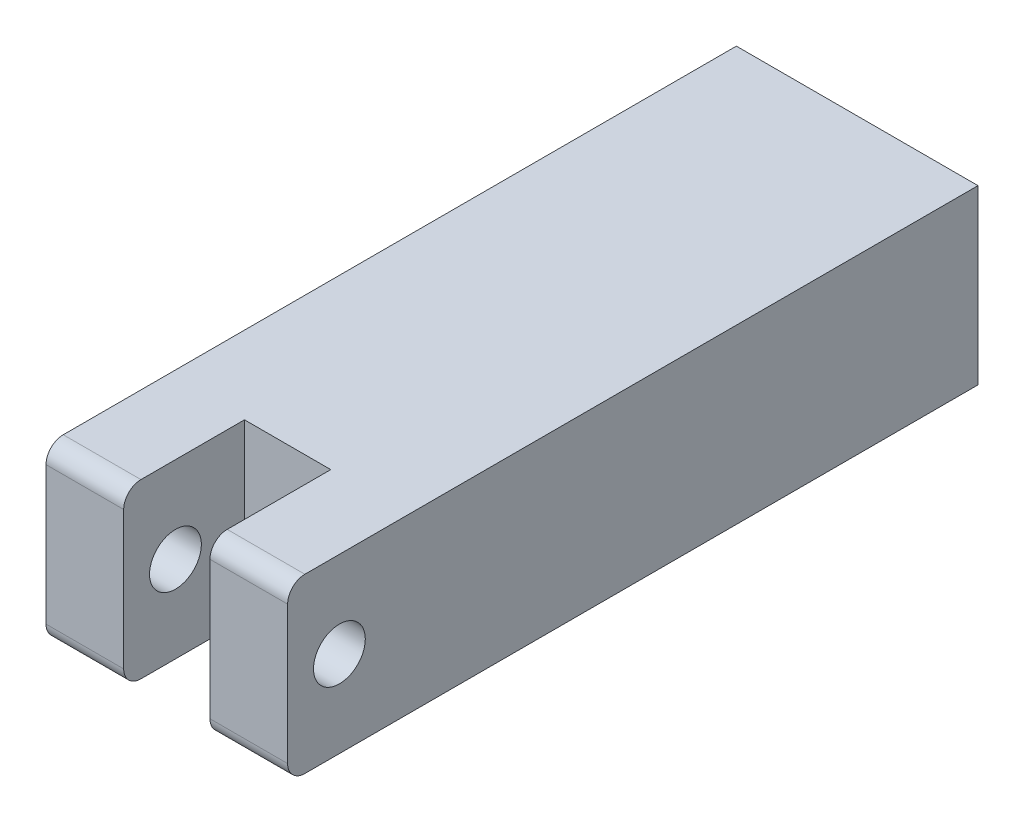
ISO-10303-21;
HEADER;
FILE_DESCRIPTION(('STEP AP214'),'2;1');
FILE_NAME('part.step','',(''),(''),'','','');
FILE_SCHEMA(('AUTOMOTIVE_DESIGN { 1 0 10303 214 1 1 1 1 }'));
ENDSEC;
DATA;
#1=APPLICATION_CONTEXT('core data for automotive mechanical design processes');
#2=APPLICATION_PROTOCOL_DEFINITION('international standard','automotive_design',2000,#1);
#3=PRODUCT_CONTEXT('',#1,'mechanical');
#4=PRODUCT('Part','Part','',(#3));
#5=PRODUCT_RELATED_PRODUCT_CATEGORY('part','',(#4));
#6=PRODUCT_DEFINITION_FORMATION('','',#4);
#7=PRODUCT_DEFINITION_CONTEXT('part definition',#1,'design');
#8=PRODUCT_DEFINITION('design','',#6,#7);
#9=PRODUCT_DEFINITION_SHAPE('','',#8);
#10=(LENGTH_UNIT() NAMED_UNIT(*) SI_UNIT(.MILLI.,.METRE.));
#11=(NAMED_UNIT(*) PLANE_ANGLE_UNIT() SI_UNIT($,.RADIAN.));
#12=(NAMED_UNIT(*) SI_UNIT($,.STERADIAN.) SOLID_ANGLE_UNIT());
#13=UNCERTAINTY_MEASURE_WITH_UNIT(LENGTH_MEASURE(1.E-05),#10,'distance_accuracy_value','');
#14=(GEOMETRIC_REPRESENTATION_CONTEXT(3) GLOBAL_UNCERTAINTY_ASSIGNED_CONTEXT((#13)) GLOBAL_UNIT_ASSIGNED_CONTEXT((#10,
#11,#12)) REPRESENTATION_CONTEXT('',''));
#15=CARTESIAN_POINT('',(0.,0.,0.));
#16=DIRECTION('',(0.,0.,1.));
#17=DIRECTION('',(1.,0.,0.));
#18=AXIS2_PLACEMENT_3D('',#15,#16,#17);
#19=CARTESIAN_POINT('',(0.,0.,13.));
#20=DIRECTION('',(0.,0.,-1.));
#21=DIRECTION('',(-1.,0.,0.));
#22=AXIS2_PLACEMENT_3D('',#19,#20,#21);
#23=CYLINDRICAL_SURFACE('',#22,1.5);
#24=CARTESIAN_POINT('',(0.,0.,-15.));
#25=DIRECTION('',(0.,0.,1.));
#26=DIRECTION('',(1.,0.,0.));
#27=AXIS2_PLACEMENT_3D('',#24,#25,#26);
#28=CIRCLE('',#27,1.5);
#29=CARTESIAN_POINT('',(-1.5,0.,-15.));
#30=VERTEX_POINT('',#29);
#31=EDGE_CURVE('E242',#30,#30,#28,.T.);
#32=CARTESIAN_POINT('',(0.,0.,-1.5));
#33=DIRECTION('',(0.,0.,1.));
#34=DIRECTION('',(1.,0.,0.));
#35=AXIS2_PLACEMENT_3D('',#32,#33,#34);
#36=CIRCLE('',#35,1.5);
#37=CARTESIAN_POINT('',(-1.5,0.,-1.5));
#38=VERTEX_POINT('',#37);
#39=EDGE_CURVE('E37',#38,#38,#36,.T.);
#40=CARTESIAN_POINT('',(-1.5,0.,-15.));
#41=CARTESIAN_POINT('',(-1.5,0.,-14.859375));
#42=CARTESIAN_POINT('',(-1.5,0.,-14.71875));
#43=CARTESIAN_POINT('',(-1.5,0.,-14.4375));
#44=CARTESIAN_POINT('',(-1.5,0.,-14.296875));
#45=CARTESIAN_POINT('',(-1.5,0.,-14.015625));
#46=CARTESIAN_POINT('',(-1.5,0.,-13.875));
#47=CARTESIAN_POINT('',(-1.5,0.,-13.59375));
#48=CARTESIAN_POINT('',(-1.5,0.,-13.453125));
#49=CARTESIAN_POINT('',(-1.5,0.,-13.171875));
#50=CARTESIAN_POINT('',(-1.5,0.,-13.03125));
#51=CARTESIAN_POINT('',(-1.5,0.,-12.75));
#52=CARTESIAN_POINT('',(-1.5,0.,-12.609375));
#53=CARTESIAN_POINT('',(-1.5,0.,-12.328125));
#54=CARTESIAN_POINT('',(-1.5,0.,-12.1875));
#55=CARTESIAN_POINT('',(-1.5,0.,-11.90625));
#56=CARTESIAN_POINT('',(-1.5,0.,-11.765625));
#57=CARTESIAN_POINT('',(-1.5,0.,-11.484375));
#58=CARTESIAN_POINT('',(-1.5,0.,-11.34375));
#59=CARTESIAN_POINT('',(-1.5,0.,-11.0625));
#60=CARTESIAN_POINT('',(-1.5,0.,-10.921875));
#61=CARTESIAN_POINT('',(-1.5,0.,-10.640625));
#62=CARTESIAN_POINT('',(-1.5,0.,-10.5));
#63=CARTESIAN_POINT('',(-1.5,0.,-10.21875));
#64=CARTESIAN_POINT('',(-1.5,0.,-10.078125));
#65=CARTESIAN_POINT('',(-1.5,0.,-9.796875));
#66=CARTESIAN_POINT('',(-1.5,0.,-9.65625));
#67=CARTESIAN_POINT('',(-1.5,0.,-9.375));
#68=CARTESIAN_POINT('',(-1.5,0.,-9.234375));
#69=CARTESIAN_POINT('',(-1.5,0.,-8.953125));
#70=CARTESIAN_POINT('',(-1.5,0.,-8.8125));
#71=CARTESIAN_POINT('',(-1.5,0.,-8.53125));
#72=CARTESIAN_POINT('',(-1.5,0.,-8.390625));
#73=CARTESIAN_POINT('',(-1.5,0.,-8.109375));
#74=CARTESIAN_POINT('',(-1.5,0.,-7.96875));
#75=CARTESIAN_POINT('',(-1.5,0.,-7.6875));
#76=CARTESIAN_POINT('',(-1.5,0.,-7.546875));
#77=CARTESIAN_POINT('',(-1.5,0.,-7.265625));
#78=CARTESIAN_POINT('',(-1.5,0.,-7.125));
#79=CARTESIAN_POINT('',(-1.5,0.,-6.84375));
#80=CARTESIAN_POINT('',(-1.5,0.,-6.703125));
#81=CARTESIAN_POINT('',(-1.5,0.,-6.421875));
#82=CARTESIAN_POINT('',(-1.5,0.,-6.28125));
#83=CARTESIAN_POINT('',(-1.5,0.,-6.));
#84=CARTESIAN_POINT('',(-1.5,0.,-5.859375));
#85=CARTESIAN_POINT('',(-1.5,0.,-5.578125));
#86=CARTESIAN_POINT('',(-1.5,0.,-5.4375));
#87=CARTESIAN_POINT('',(-1.5,0.,-5.15625));
#88=CARTESIAN_POINT('',(-1.5,0.,-5.015625));
#89=CARTESIAN_POINT('',(-1.5,0.,-4.734375));
#90=CARTESIAN_POINT('',(-1.5,0.,-4.59375));
#91=CARTESIAN_POINT('',(-1.5,0.,-4.3125));
#92=CARTESIAN_POINT('',(-1.5,0.,-4.171875));
#93=CARTESIAN_POINT('',(-1.5,0.,-3.890625));
#94=CARTESIAN_POINT('',(-1.5,0.,-3.75));
#95=CARTESIAN_POINT('',(-1.5,0.,-3.46875));
#96=CARTESIAN_POINT('',(-1.5,0.,-3.328125));
#97=CARTESIAN_POINT('',(-1.5,0.,-3.046875));
#98=CARTESIAN_POINT('',(-1.5,0.,-2.90625));
#99=CARTESIAN_POINT('',(-1.5,0.,-2.625));
#100=CARTESIAN_POINT('',(-1.5,0.,-2.484375));
#101=CARTESIAN_POINT('',(-1.5,0.,-2.203125));
#102=CARTESIAN_POINT('',(-1.5,0.,-2.0625));
#103=CARTESIAN_POINT('',(-1.5,0.,-1.78125));
#104=CARTESIAN_POINT('',(-1.5,0.,-1.640625));
#105=CARTESIAN_POINT('',(-1.5,0.,-1.5));
#106=B_SPLINE_CURVE_WITH_KNOTS('',3,(#40,#41,#42,#43,#44,#45,#46,#47,#48,#49,#50,#51,#52,#53,
#54,#55,#56,#57,#58,#59,#60,#61,#62,#63,#64,#65,#66,#67,#68,#69,#70,#71,#72,#73,#74,#75,#76,#77,
#78,#79,#80,#81,#82,#83,#84,#85,#86,#87,#88,#89,#90,#91,#92,#93,#94,#95,#96,#97,#98,#99,#100,
#101,#102,#103,#104,#105),.UNSPECIFIED.,.F.,.F.,(4,2,2,2,2,2,2,2,2,2,2,2,2,2,2,2,2,2,2,2,2,2,2,
2,2,2,2,2,2,2,2,2,4),(0.,0.421874999999999,0.843750000000001,1.265625,1.6875,2.109375,2.53125,
2.953125,3.375,3.796875,4.21875,4.640625,5.0625,5.484375,5.90625,6.328125,6.75,7.171875,7.59375,
8.015625,8.4375,8.859375,9.28125,9.703125,10.125,10.546875,10.96875,11.390625,11.8125,12.234375,
12.65625,13.078125,13.5),.UNSPECIFIED.);
#107=EDGE_CURVE('BSEAM33',#30,#38,#106,.T.);
#108=ORIENTED_EDGE('',*,*,#31,.F.);
#109=ORIENTED_EDGE('',*,*,#39,.T.);
#110=ORIENTED_EDGE('',*,*,#107,.T.);
#111=ORIENTED_EDGE('',*,*,#107,.F.);
#112=EDGE_LOOP('',(#108,#110,#109,#111));
#113=FACE_BOUND('',#112,.T.);
#114=ADVANCED_FACE('F33',(#113),#23,.F.);
#115=CARTESIAN_POINT('',(7.,4.,24.));
#116=DIRECTION('',(-1.,0.,0.));
#117=DIRECTION('',(0.,0.,1.));
#118=AXIS2_PLACEMENT_3D('',#115,#116,#117);
#119=CYLINDRICAL_SURFACE('',#118,1.);
#120=DIRECTION('',(-1.,0.,0.));
#121=VECTOR('',#120,1.);
#122=CARTESIAN_POINT('',(7.,4.,25.));
#123=LINE('',#122,#121);
#124=CARTESIAN_POINT('',(-2.5,4.,25.));
#125=VERTEX_POINT('',#124);
#126=CARTESIAN_POINT('',(-7.,4.,25.));
#127=VERTEX_POINT('',#126);
#128=EDGE_CURVE('E295',#125,#127,#123,.T.);
#129=ORIENTED_EDGE('',*,*,#128,.F.);
#130=CARTESIAN_POINT('',(-2.5,4.,24.));
#131=DIRECTION('',(-1.,0.,0.));
#132=DIRECTION('',(0.,0.,1.));
#133=AXIS2_PLACEMENT_3D('',#130,#131,#132);
#134=CIRCLE('',#133,1.);
#135=CARTESIAN_POINT('',(-2.5,5.,24.));
#136=VERTEX_POINT('',#135);
#137=EDGE_CURVE('E239',#125,#136,#134,.T.);
#138=ORIENTED_EDGE('',*,*,#137,.T.);
#139=DIRECTION('',(-1.,0.,0.));
#140=VECTOR('',#139,1.);
#141=CARTESIAN_POINT('',(7.,5.,24.));
#142=LINE('',#141,#140);
#143=CARTESIAN_POINT('',(-7.,5.,24.));
#144=VERTEX_POINT('',#143);
#145=EDGE_CURVE('E299',#136,#144,#142,.T.);
#146=ORIENTED_EDGE('',*,*,#145,.T.);
#147=CARTESIAN_POINT('',(-7.,4.,24.));
#148=DIRECTION('',(1.,0.,0.));
#149=DIRECTION('',(0.,0.,-1.));
#150=AXIS2_PLACEMENT_3D('',#147,#148,#149);
#151=CIRCLE('',#150,1.);
#152=EDGE_CURVE('E275',#144,#127,#151,.T.);
#153=ORIENTED_EDGE('',*,*,#152,.T.);
#154=EDGE_LOOP('',(#129,#138,#146,#153));
#155=FACE_BOUND('',#154,.T.);
#156=ADVANCED_FACE('F325',(#155),#119,.T.);
#157=CARTESIAN_POINT('',(7.,4.,25.));
#158=DIRECTION('',(0.,0.,-1.));
#159=DIRECTION('',(-1.,0.,0.));
#160=AXIS2_PLACEMENT_3D('',#157,#158,#159);
#161=PLANE('',#160);
#162=DIRECTION('',(-1.,0.,0.));
#163=VECTOR('',#162,1.);
#164=CARTESIAN_POINT('',(7.,-4.,25.));
#165=LINE('',#164,#163);
#166=CARTESIAN_POINT('',(-2.5,-4.,25.));
#167=VERTEX_POINT('',#166);
#168=CARTESIAN_POINT('',(-7.,-4.,25.));
#169=VERTEX_POINT('',#168);
#170=EDGE_CURVE('E291',#167,#169,#165,.T.);
#171=ORIENTED_EDGE('',*,*,#170,.F.);
#172=DIRECTION('',(0.,1.,0.));
#173=VECTOR('',#172,1.);
#174=CARTESIAN_POINT('',(-2.5,-5.,25.));
#175=LINE('',#174,#173);
#176=EDGE_CURVE('E219',#167,#125,#175,.T.);
#177=ORIENTED_EDGE('',*,*,#176,.T.);
#178=ORIENTED_EDGE('',*,*,#128,.T.);
#179=DIRECTION('',(0.,-1.,0.));
#180=VECTOR('',#179,1.);
#181=CARTESIAN_POINT('',(-7.,4.,25.));
#182=LINE('',#181,#180);
#183=EDGE_CURVE('E278',#127,#169,#182,.T.);
#184=ORIENTED_EDGE('',*,*,#183,.T.);
#185=EDGE_LOOP('',(#171,#177,#178,#184));
#186=FACE_BOUND('',#185,.T.);
#187=ADVANCED_FACE('F332',(#186),#161,.F.);
#188=CARTESIAN_POINT('',(7.,-4.,24.));
#189=DIRECTION('',(-1.,0.,0.));
#190=DIRECTION('',(0.,0.,1.));
#191=AXIS2_PLACEMENT_3D('',#188,#189,#190);
#192=CYLINDRICAL_SURFACE('',#191,1.);
#193=DIRECTION('',(-1.,0.,0.));
#194=VECTOR('',#193,1.);
#195=CARTESIAN_POINT('',(7.,-5.,24.));
#196=LINE('',#195,#194);
#197=CARTESIAN_POINT('',(-2.5,-5.,24.));
#198=VERTEX_POINT('',#197);
#199=CARTESIAN_POINT('',(-7.,-5.,24.));
#200=VERTEX_POINT('',#199);
#201=EDGE_CURVE('E287',#198,#200,#196,.T.);
#202=ORIENTED_EDGE('',*,*,#201,.F.);
#203=CARTESIAN_POINT('',(-2.5,-4.,24.));
#204=DIRECTION('',(-1.,0.,0.));
#205=DIRECTION('',(0.,0.,1.));
#206=AXIS2_PLACEMENT_3D('',#203,#204,#205);
#207=CIRCLE('',#206,1.);
#208=EDGE_CURVE('E236',#198,#167,#207,.T.);
#209=ORIENTED_EDGE('',*,*,#208,.T.);
#210=ORIENTED_EDGE('',*,*,#170,.T.);
#211=CARTESIAN_POINT('',(-7.,-4.,24.));
#212=DIRECTION('',(1.,0.,0.));
#213=DIRECTION('',(0.,0.,-1.));
#214=AXIS2_PLACEMENT_3D('',#211,#212,#213);
#215=CIRCLE('',#214,1.);
#216=EDGE_CURVE('E281',#169,#200,#215,.T.);
#217=ORIENTED_EDGE('',*,*,#216,.T.);
#218=EDGE_LOOP('',(#202,#209,#210,#217));
#219=FACE_BOUND('',#218,.T.);
#220=ADVANCED_FACE('F427',(#219),#192,.T.);
#221=CARTESIAN_POINT('',(7.,0.,22.));
#222=DIRECTION('',(-1.,0.,0.));
#223=DIRECTION('',(0.,0.,1.));
#224=AXIS2_PLACEMENT_3D('',#221,#222,#223);
#225=CYLINDRICAL_SURFACE('',#224,1.5);
#226=CARTESIAN_POINT('',(-2.5,0.,22.));
#227=DIRECTION('',(-1.,0.,0.));
#228=DIRECTION('',(0.,0.,1.));
#229=AXIS2_PLACEMENT_3D('',#226,#227,#228);
#230=CIRCLE('',#229,1.5);
#231=CARTESIAN_POINT('',(-2.5,0.,23.5));
#232=VERTEX_POINT('',#231);
#233=EDGE_CURVE('E235',#232,#232,#230,.T.);
#234=ORIENTED_EDGE('',*,*,#233,.F.);
#235=EDGE_LOOP('',(#234));
#236=FACE_BOUND('',#235,.T.);
#237=CARTESIAN_POINT('',(-7.,0.,22.));
#238=DIRECTION('',(1.,0.,0.));
#239=DIRECTION('',(0.,0.,-1.));
#240=AXIS2_PLACEMENT_3D('',#237,#238,#239);
#241=CIRCLE('',#240,1.5);
#242=CARTESIAN_POINT('',(-7.,0.,20.5));
#243=VERTEX_POINT('',#242);
#244=EDGE_CURVE('E248',#243,#243,#241,.T.);
#245=ORIENTED_EDGE('',*,*,#244,.F.);
#246=EDGE_LOOP('',(#245));
#247=FACE_BOUND('',#246,.T.);
#248=ADVANCED_FACE('F420',(#236,#247),#225,.F.);
#249=CARTESIAN_POINT('',(7.,-4.,24.));
#250=DIRECTION('',(1.,0.,0.));
#251=DIRECTION('',(0.,0.,-1.));
#252=AXIS2_PLACEMENT_3D('',#249,#250,#251);
#253=PLANE('',#252);
#254=DIRECTION('',(0.,1.,0.));
#255=VECTOR('',#254,1.);
#256=CARTESIAN_POINT('',(7.,5.,-15.));
#257=LINE('',#256,#255);
#258=CARTESIAN_POINT('',(7.,-5.,-15.));
#259=VERTEX_POINT('',#258);
#260=CARTESIAN_POINT('',(7.,5.,-15.));
#261=VERTEX_POINT('',#260);
#262=EDGE_CURVE('E255',#259,#261,#257,.T.);
#263=ORIENTED_EDGE('',*,*,#262,.T.);
#264=DIRECTION('',(0.,0.,1.));
#265=VECTOR('',#264,1.);
#266=CARTESIAN_POINT('',(7.,5.,24.));
#267=LINE('',#266,#265);
#268=CARTESIAN_POINT('',(7.,5.,24.));
#269=VERTEX_POINT('',#268);
#270=EDGE_CURVE('E258',#261,#269,#267,.T.);
#271=ORIENTED_EDGE('',*,*,#270,.T.);
#272=CARTESIAN_POINT('',(7.,4.,24.));
#273=DIRECTION('',(1.,0.,0.));
#274=DIRECTION('',(0.,0.,-1.));
#275=AXIS2_PLACEMENT_3D('',#272,#273,#274);
#276=CIRCLE('',#275,1.);
#277=CARTESIAN_POINT('',(7.,4.,25.));
#278=VERTEX_POINT('',#277);
#279=EDGE_CURVE('E261',#269,#278,#276,.T.);
#280=ORIENTED_EDGE('',*,*,#279,.T.);
#281=DIRECTION('',(0.,-1.,0.));
#282=VECTOR('',#281,1.);
#283=CARTESIAN_POINT('',(7.,4.,25.));
#284=LINE('',#283,#282);
#285=CARTESIAN_POINT('',(7.,-4.,25.));
#286=VERTEX_POINT('',#285);
#287=EDGE_CURVE('E263',#278,#286,#284,.T.);
#288=ORIENTED_EDGE('',*,*,#287,.T.);
#289=CARTESIAN_POINT('',(7.,-4.,24.));
#290=DIRECTION('',(1.,0.,0.));
#291=DIRECTION('',(0.,0.,-1.));
#292=AXIS2_PLACEMENT_3D('',#289,#290,#291);
#293=CIRCLE('',#292,1.);
#294=CARTESIAN_POINT('',(7.,-5.,24.));
#295=VERTEX_POINT('',#294);
#296=EDGE_CURVE('E265',#286,#295,#293,.T.);
#297=ORIENTED_EDGE('',*,*,#296,.T.);
#298=DIRECTION('',(0.,0.,-1.));
#299=VECTOR('',#298,1.);
#300=CARTESIAN_POINT('',(7.,-5.,24.));
#301=LINE('',#300,#299);
#302=EDGE_CURVE('E267',#295,#259,#301,.T.);
#303=ORIENTED_EDGE('',*,*,#302,.T.);
#304=EDGE_LOOP('',(#263,#271,#280,#288,#297,#303));
#305=FACE_BOUND('',#304,.T.);
#306=CARTESIAN_POINT('',(7.,0.,22.));
#307=DIRECTION('',(1.,0.,0.));
#308=DIRECTION('',(0.,0.,-1.));
#309=AXIS2_PLACEMENT_3D('',#306,#307,#308);
#310=CIRCLE('',#309,1.5);
#311=CARTESIAN_POINT('',(7.,0.,20.5));
#312=VERTEX_POINT('',#311);
#313=EDGE_CURVE('E249',#312,#312,#310,.T.);
#314=ORIENTED_EDGE('',*,*,#313,.F.);
#315=EDGE_LOOP('',(#314));
#316=FACE_BOUND('',#315,.T.);
#317=ADVANCED_FACE('F426',(#305,#316),#253,.T.);
#318=CARTESIAN_POINT('',(-7.,-4.,24.));
#319=DIRECTION('',(1.,0.,0.));
#320=DIRECTION('',(0.,0.,-1.));
#321=AXIS2_PLACEMENT_3D('',#318,#319,#320);
#322=PLANE('',#321);
#323=DIRECTION('',(0.,0.,1.));
#324=VECTOR('',#323,1.);
#325=CARTESIAN_POINT('',(-7.,3.,1.5));
#326=LINE('',#325,#324);
#327=CARTESIAN_POINT('',(-7.,3.,-1.5));
#328=VERTEX_POINT('',#327);
#329=CARTESIAN_POINT('',(-7.,3.,1.5));
#330=VERTEX_POINT('',#329);
#331=EDGE_CURVE('E179',#328,#330,#326,.T.);
#332=ORIENTED_EDGE('',*,*,#331,.T.);
#333=DIRECTION('',(0.,-1.,0.));
#334=VECTOR('',#333,1.);
#335=CARTESIAN_POINT('',(-7.,3.,1.5));
#336=LINE('',#335,#334);
#337=CARTESIAN_POINT('',(-7.,-3.,1.5));
#338=VERTEX_POINT('',#337);
#339=EDGE_CURVE('E161',#330,#338,#336,.T.);
#340=ORIENTED_EDGE('',*,*,#339,.T.);
#341=DIRECTION('',(0.,0.,-1.));
#342=VECTOR('',#341,1.);
#343=CARTESIAN_POINT('',(-7.,-3.,1.5));
#344=LINE('',#343,#342);
#345=CARTESIAN_POINT('',(-7.,-3.,-1.5));
#346=VERTEX_POINT('',#345);
#347=EDGE_CURVE('E170',#338,#346,#344,.T.);
#348=ORIENTED_EDGE('',*,*,#347,.T.);
#349=DIRECTION('',(0.,1.,0.));
#350=VECTOR('',#349,1.);
#351=CARTESIAN_POINT('',(-7.,3.,-1.5));
#352=LINE('',#351,#350);
#353=EDGE_CURVE('E174',#346,#328,#352,.T.);
#354=ORIENTED_EDGE('',*,*,#353,.T.);
#355=EDGE_LOOP('',(#332,#340,#348,#354));
#356=FACE_BOUND('',#355,.T.);
#357=DIRECTION('',(0.,1.,0.));
#358=VECTOR('',#357,1.);
#359=CARTESIAN_POINT('',(-7.,5.,-15.));
#360=LINE('',#359,#358);
#361=CARTESIAN_POINT('',(-7.,-5.,-15.));
#362=VERTEX_POINT('',#361);
#363=CARTESIAN_POINT('',(-7.,5.,-15.));
#364=VERTEX_POINT('',#363);
#365=EDGE_CURVE('E252',#362,#364,#360,.T.);
#366=ORIENTED_EDGE('',*,*,#365,.F.);
#367=DIRECTION('',(0.,0.,-1.));
#368=VECTOR('',#367,1.);
#369=CARTESIAN_POINT('',(-7.,-5.,24.));
#370=LINE('',#369,#368);
#371=EDGE_CURVE('E259',#200,#362,#370,.T.);
#372=ORIENTED_EDGE('',*,*,#371,.F.);
#373=ORIENTED_EDGE('',*,*,#216,.F.);
#374=ORIENTED_EDGE('',*,*,#183,.F.);
#375=ORIENTED_EDGE('',*,*,#152,.F.);
#376=DIRECTION('',(0.,0.,1.));
#377=VECTOR('',#376,1.);
#378=CARTESIAN_POINT('',(-7.,5.,24.));
#379=LINE('',#378,#377);
#380=EDGE_CURVE('E272',#364,#144,#379,.T.);
#381=ORIENTED_EDGE('',*,*,#380,.F.);
#382=EDGE_LOOP('',(#366,#372,#373,#374,#375,#381));
#383=FACE_BOUND('',#382,.T.);
#384=ORIENTED_EDGE('',*,*,#244,.T.);
#385=EDGE_LOOP('',(#384));
#386=FACE_BOUND('',#385,.T.);
#387=ADVANCED_FACE('F176',(#356,#383,#386),#322,.F.);
#388=CARTESIAN_POINT('',(7.,5.,-15.));
#389=DIRECTION('',(0.,0.,1.));
#390=DIRECTION('',(0.,-1.,0.));
#391=AXIS2_PLACEMENT_3D('',#388,#389,#390);
#392=PLANE('',#391);
#393=ORIENTED_EDGE('',*,*,#31,.T.);
#394=EDGE_LOOP('',(#393));
#395=FACE_BOUND('',#394,.T.);
#396=ORIENTED_EDGE('',*,*,#365,.T.);
#397=DIRECTION('',(-1.,0.,0.));
#398=VECTOR('',#397,1.);
#399=CARTESIAN_POINT('',(7.,5.,-15.));
#400=LINE('',#399,#398);
#401=EDGE_CURVE('E11',#261,#364,#400,.T.);
#402=ORIENTED_EDGE('',*,*,#401,.F.);
#403=ORIENTED_EDGE('',*,*,#262,.F.);
#404=DIRECTION('',(-1.,0.,0.));
#405=VECTOR('',#404,1.);
#406=CARTESIAN_POINT('',(7.,-5.,-15.));
#407=LINE('',#406,#405);
#408=EDGE_CURVE('E269',#259,#362,#407,.T.);
#409=ORIENTED_EDGE('',*,*,#408,.T.);
#410=EDGE_LOOP('',(#396,#402,#403,#409));
#411=FACE_BOUND('',#410,.T.);
#412=ADVANCED_FACE('F35',(#395,#411),#392,.F.);
#413=CARTESIAN_POINT('',(7.,5.,24.));
#414=DIRECTION('',(0.,-1.,0.));
#415=DIRECTION('',(0.,0.,-1.));
#416=AXIS2_PLACEMENT_3D('',#413,#414,#415);
#417=PLANE('',#416);
#418=ORIENTED_EDGE('',*,*,#145,.F.);
#419=DIRECTION('',(0.,0.,1.));
#420=VECTOR('',#419,1.);
#421=CARTESIAN_POINT('',(-2.5,5.,18.));
#422=LINE('',#421,#420);
#423=CARTESIAN_POINT('',(-2.5,5.,18.));
#424=VERTEX_POINT('',#423);
#425=EDGE_CURVE('E205',#424,#136,#422,.T.);
#426=ORIENTED_EDGE('',*,*,#425,.F.);
#427=DIRECTION('',(-1.,0.,0.));
#428=VECTOR('',#427,1.);
#429=CARTESIAN_POINT('',(-2.5,5.,18.));
#430=LINE('',#429,#428);
#431=CARTESIAN_POINT('',(2.5,5.,18.));
#432=VERTEX_POINT('',#431);
#433=EDGE_CURVE('E209',#432,#424,#430,.T.);
#434=ORIENTED_EDGE('',*,*,#433,.F.);
#435=DIRECTION('',(0.,0.,-1.));
#436=VECTOR('',#435,1.);
#437=CARTESIAN_POINT('',(2.5,5.,18.));
#438=LINE('',#437,#436);
#439=CARTESIAN_POINT('',(2.5,5.,24.));
#440=VERTEX_POINT('',#439);
#441=EDGE_CURVE('E207',#440,#432,#438,.T.);
#442=ORIENTED_EDGE('',*,*,#441,.F.);
#443=EDGE_CURVE('E42',#269,#440,#142,.T.);
#444=ORIENTED_EDGE('',*,*,#443,.F.);
#445=ORIENTED_EDGE('',*,*,#270,.F.);
#446=ORIENTED_EDGE('',*,*,#401,.T.);
#447=ORIENTED_EDGE('',*,*,#380,.T.);
#448=EDGE_LOOP('',(#418,#426,#434,#442,#444,#445,#446,#447));
#449=FACE_BOUND('',#448,.T.);
#450=ADVANCED_FACE('F503',(#449),#417,.F.);
#451=ORIENTED_EDGE('',*,*,#443,.T.);
#452=CARTESIAN_POINT('',(2.5,4.,24.));
#453=DIRECTION('',(1.,0.,0.));
#454=DIRECTION('',(0.,0.,-1.));
#455=AXIS2_PLACEMENT_3D('',#452,#453,#454);
#456=CIRCLE('',#455,1.);
#457=CARTESIAN_POINT('',(2.5,4.,25.));
#458=VERTEX_POINT('',#457);
#459=EDGE_CURVE('E232',#440,#458,#456,.T.);
#460=ORIENTED_EDGE('',*,*,#459,.T.);
#461=EDGE_CURVE('E296',#278,#458,#123,.T.);
#462=ORIENTED_EDGE('',*,*,#461,.F.);
#463=ORIENTED_EDGE('',*,*,#279,.F.);
#464=EDGE_LOOP('',(#451,#460,#462,#463));
#465=FACE_BOUND('',#464,.T.);
#466=ADVANCED_FACE('F335',(#465),#119,.T.);
#467=ORIENTED_EDGE('',*,*,#461,.T.);
#468=DIRECTION('',(0.,1.,0.));
#469=VECTOR('',#468,1.);
#470=CARTESIAN_POINT('',(2.5,-5.,25.));
#471=LINE('',#470,#469);
#472=CARTESIAN_POINT('',(2.5,-4.,25.));
#473=VERTEX_POINT('',#472);
#474=EDGE_CURVE('E225',#473,#458,#471,.T.);
#475=ORIENTED_EDGE('',*,*,#474,.F.);
#476=EDGE_CURVE('E292',#286,#473,#165,.T.);
#477=ORIENTED_EDGE('',*,*,#476,.F.);
#478=ORIENTED_EDGE('',*,*,#287,.F.);
#479=EDGE_LOOP('',(#467,#475,#477,#478));
#480=FACE_BOUND('',#479,.T.);
#481=ADVANCED_FACE('F447',(#480),#161,.F.);
#482=ORIENTED_EDGE('',*,*,#476,.T.);
#483=CARTESIAN_POINT('',(2.5,-4.,24.));
#484=DIRECTION('',(1.,0.,0.));
#485=DIRECTION('',(0.,0.,-1.));
#486=AXIS2_PLACEMENT_3D('',#483,#484,#485);
#487=CIRCLE('',#486,1.);
#488=CARTESIAN_POINT('',(2.5,-5.,24.));
#489=VERTEX_POINT('',#488);
#490=EDGE_CURVE('E229',#473,#489,#487,.T.);
#491=ORIENTED_EDGE('',*,*,#490,.T.);
#492=EDGE_CURVE('E288',#295,#489,#196,.T.);
#493=ORIENTED_EDGE('',*,*,#492,.F.);
#494=ORIENTED_EDGE('',*,*,#296,.F.);
#495=EDGE_LOOP('',(#482,#491,#493,#494));
#496=FACE_BOUND('',#495,.T.);
#497=ADVANCED_FACE('F438',(#496),#192,.T.);
#498=CARTESIAN_POINT('',(7.,-5.,24.));
#499=DIRECTION('',(0.,1.,0.));
#500=DIRECTION('',(0.,0.,1.));
#501=AXIS2_PLACEMENT_3D('',#498,#499,#500);
#502=PLANE('',#501);
#503=DIRECTION('',(-1.,0.,0.));
#504=VECTOR('',#503,1.);
#505=CARTESIAN_POINT('',(-2.5,-5.,18.));
#506=LINE('',#505,#504);
#507=CARTESIAN_POINT('',(2.5,-5.,18.));
#508=VERTEX_POINT('',#507);
#509=CARTESIAN_POINT('',(-2.5,-5.,18.));
#510=VERTEX_POINT('',#509);
#511=EDGE_CURVE('E58',#508,#510,#506,.T.);
#512=ORIENTED_EDGE('',*,*,#511,.T.);
#513=DIRECTION('',(0.,0.,1.));
#514=VECTOR('',#513,1.);
#515=CARTESIAN_POINT('',(-2.5,-5.,18.));
#516=LINE('',#515,#514);
#517=EDGE_CURVE('E212',#510,#198,#516,.T.);
#518=ORIENTED_EDGE('',*,*,#517,.T.);
#519=ORIENTED_EDGE('',*,*,#201,.T.);
#520=ORIENTED_EDGE('',*,*,#371,.T.);
#521=ORIENTED_EDGE('',*,*,#408,.F.);
#522=ORIENTED_EDGE('',*,*,#302,.F.);
#523=ORIENTED_EDGE('',*,*,#492,.T.);
#524=DIRECTION('',(0.,0.,-1.));
#525=VECTOR('',#524,1.);
#526=CARTESIAN_POINT('',(2.5,-5.,18.));
#527=LINE('',#526,#525);
#528=EDGE_CURVE('E215',#489,#508,#527,.T.);
#529=ORIENTED_EDGE('',*,*,#528,.T.);
#530=EDGE_LOOP('',(#512,#518,#519,#520,#521,#522,#523,#529));
#531=FACE_BOUND('',#530,.T.);
#532=ADVANCED_FACE('F526',(#531),#502,.F.);
#533=CARTESIAN_POINT('',(2.5,0.,22.));
#534=DIRECTION('',(1.,0.,0.));
#535=DIRECTION('',(0.,0.,-1.));
#536=AXIS2_PLACEMENT_3D('',#533,#534,#535);
#537=CIRCLE('',#536,1.5);
#538=CARTESIAN_POINT('',(2.5,0.,20.5));
#539=VERTEX_POINT('',#538);
#540=EDGE_CURVE('E222',#539,#539,#537,.T.);
#541=ORIENTED_EDGE('',*,*,#540,.F.);
#542=EDGE_LOOP('',(#541));
#543=FACE_BOUND('',#542,.T.);
#544=ORIENTED_EDGE('',*,*,#313,.T.);
#545=EDGE_LOOP('',(#544));
#546=FACE_BOUND('',#545,.T.);
#547=ADVANCED_FACE('F354',(#543,#546),#225,.F.);
#548=CARTESIAN_POINT('',(-2.5,-5.,18.));
#549=DIRECTION('',(-1.,0.,0.));
#550=DIRECTION('',(0.,0.,1.));
#551=AXIS2_PLACEMENT_3D('',#548,#549,#550);
#552=PLANE('',#551);
#553=ORIENTED_EDGE('',*,*,#233,.T.);
#554=EDGE_LOOP('',(#553));
#555=FACE_BOUND('',#554,.T.);
#556=ORIENTED_EDGE('',*,*,#176,.F.);
#557=ORIENTED_EDGE('',*,*,#208,.F.);
#558=ORIENTED_EDGE('',*,*,#517,.F.);
#559=DIRECTION('',(0.,1.,0.));
#560=VECTOR('',#559,1.);
#561=CARTESIAN_POINT('',(-2.5,-5.,18.));
#562=LINE('',#561,#560);
#563=EDGE_CURVE('E220',#510,#424,#562,.T.);
#564=ORIENTED_EDGE('',*,*,#563,.T.);
#565=ORIENTED_EDGE('',*,*,#425,.T.);
#566=ORIENTED_EDGE('',*,*,#137,.F.);
#567=EDGE_LOOP('',(#556,#557,#558,#564,#565,#566));
#568=FACE_BOUND('',#567,.T.);
#569=ADVANCED_FACE('F350',(#555,#568),#552,.F.);
#570=CARTESIAN_POINT('',(2.5,-5.,18.));
#571=DIRECTION('',(1.,0.,0.));
#572=DIRECTION('',(0.,0.,-1.));
#573=AXIS2_PLACEMENT_3D('',#570,#571,#572);
#574=PLANE('',#573);
#575=ORIENTED_EDGE('',*,*,#540,.T.);
#576=EDGE_LOOP('',(#575));
#577=FACE_BOUND('',#576,.T.);
#578=ORIENTED_EDGE('',*,*,#441,.T.);
#579=DIRECTION('',(0.,1.,0.));
#580=VECTOR('',#579,1.);
#581=CARTESIAN_POINT('',(2.5,-5.,18.));
#582=LINE('',#581,#580);
#583=EDGE_CURVE('E223',#508,#432,#582,.T.);
#584=ORIENTED_EDGE('',*,*,#583,.F.);
#585=ORIENTED_EDGE('',*,*,#528,.F.);
#586=ORIENTED_EDGE('',*,*,#490,.F.);
#587=ORIENTED_EDGE('',*,*,#474,.T.);
#588=ORIENTED_EDGE('',*,*,#459,.F.);
#589=EDGE_LOOP('',(#578,#584,#585,#586,#587,#588));
#590=FACE_BOUND('',#589,.T.);
#591=ADVANCED_FACE('F353',(#577,#590),#574,.F.);
#592=CARTESIAN_POINT('',(-2.5,-5.,18.));
#593=DIRECTION('',(0.,0.,-1.));
#594=DIRECTION('',(-1.,0.,0.));
#595=AXIS2_PLACEMENT_3D('',#592,#593,#594);
#596=PLANE('',#595);
#597=ORIENTED_EDGE('',*,*,#563,.F.);
#598=ORIENTED_EDGE('',*,*,#511,.F.);
#599=ORIENTED_EDGE('',*,*,#583,.T.);
#600=ORIENTED_EDGE('',*,*,#433,.T.);
#601=EDGE_LOOP('',(#597,#598,#599,#600));
#602=FACE_BOUND('',#601,.T.);
#603=ADVANCED_FACE('F358',(#602),#596,.F.);
#604=CARTESIAN_POINT('',(3.46410161513776,0.,-1.5));
#605=DIRECTION('',(0.866025403784438,0.5,0.));
#606=DIRECTION('',(-0.5,0.866025403784439,0.));
#607=AXIS2_PLACEMENT_3D('',#604,#605,#606);
#608=PLANE('',#607);
#609=DIRECTION('',(-0.5,0.866025403784439,0.));
#610=VECTOR('',#609,1.);
#611=CARTESIAN_POINT('',(3.46410161513776,0.,1.5));
#612=LINE('',#611,#610);
#613=CARTESIAN_POINT('',(3.46410161513776,0.,1.5));
#614=VERTEX_POINT('',#613);
#615=CARTESIAN_POINT('',(1.73205080756888,3.,1.5));
#616=VERTEX_POINT('',#615);
#617=EDGE_CURVE('E184',#614,#616,#612,.T.);
#618=ORIENTED_EDGE('',*,*,#617,.T.);
#619=DIRECTION('',(0.,0.,1.));
#620=VECTOR('',#619,1.);
#621=CARTESIAN_POINT('',(1.73205080756888,3.,-1.5));
#622=LINE('',#621,#620);
#623=CARTESIAN_POINT('',(1.73205080756888,3.,-1.5));
#624=VERTEX_POINT('',#623);
#625=EDGE_CURVE('E194',#624,#616,#622,.T.);
#626=ORIENTED_EDGE('',*,*,#625,.F.);
#627=DIRECTION('',(-0.5,0.866025403784439,0.));
#628=VECTOR('',#627,1.);
#629=CARTESIAN_POINT('',(3.46410161513776,0.,-1.5));
#630=LINE('',#629,#628);
#631=CARTESIAN_POINT('',(3.46410161513776,0.,-1.5));
#632=VERTEX_POINT('',#631);
#633=EDGE_CURVE('E185',#632,#624,#630,.T.);
#634=ORIENTED_EDGE('',*,*,#633,.F.);
#635=DIRECTION('',(0.,0.,1.));
#636=VECTOR('',#635,1.);
#637=CARTESIAN_POINT('',(3.46410161513776,0.,-1.5));
#638=LINE('',#637,#636);
#639=EDGE_CURVE('E199',#632,#614,#638,.T.);
#640=ORIENTED_EDGE('',*,*,#639,.T.);
#641=EDGE_LOOP('',(#618,#626,#634,#640));
#642=FACE_BOUND('',#641,.T.);
#643=ADVANCED_FACE('F362',(#642),#608,.F.);
#644=CARTESIAN_POINT('',(1.73205080756888,-3.,-1.5));
#645=DIRECTION('',(0.866025403784439,-0.5,0.));
#646=DIRECTION('',(0.5,0.866025403784439,0.));
#647=AXIS2_PLACEMENT_3D('',#644,#645,#646);
#648=PLANE('',#647);
#649=DIRECTION('',(0.5,0.866025403784439,0.));
#650=VECTOR('',#649,1.);
#651=CARTESIAN_POINT('',(1.73205080756888,-3.,1.5));
#652=LINE('',#651,#650);
#653=CARTESIAN_POINT('',(1.73205080756888,-3.,1.5));
#654=VERTEX_POINT('',#653);
#655=EDGE_CURVE('E165',#654,#614,#652,.T.);
#656=ORIENTED_EDGE('',*,*,#655,.T.);
#657=ORIENTED_EDGE('',*,*,#639,.F.);
#658=DIRECTION('',(0.5,0.866025403784439,0.));
#659=VECTOR('',#658,1.);
#660=CARTESIAN_POINT('',(1.73205080756888,-3.,-1.5));
#661=LINE('',#660,#659);
#662=CARTESIAN_POINT('',(1.73205080756888,-3.,-1.5));
#663=VERTEX_POINT('',#662);
#664=EDGE_CURVE('E191',#663,#632,#661,.T.);
#665=ORIENTED_EDGE('',*,*,#664,.F.);
#666=DIRECTION('',(0.,0.,1.));
#667=VECTOR('',#666,1.);
#668=CARTESIAN_POINT('',(1.73205080756888,-3.,-1.5));
#669=LINE('',#668,#667);
#670=EDGE_CURVE('E202',#663,#654,#669,.T.);
#671=ORIENTED_EDGE('',*,*,#670,.T.);
#672=EDGE_LOOP('',(#656,#657,#665,#671));
#673=FACE_BOUND('',#672,.T.);
#674=ADVANCED_FACE('F364',(#673),#648,.F.);
#675=CARTESIAN_POINT('',(-1.73205080756888,-3.,-1.5));
#676=DIRECTION('',(0.,-1.,0.));
#677=DIRECTION('',(1.,0.,0.));
#678=AXIS2_PLACEMENT_3D('',#675,#676,#677);
#679=PLANE('',#678);
#680=ORIENTED_EDGE('',*,*,#670,.F.);
#681=DIRECTION('',(1.,0.,0.));
#682=VECTOR('',#681,1.);
#683=CARTESIAN_POINT('',(-1.73205080756888,-3.,-1.5));
#684=LINE('',#683,#682);
#685=EDGE_CURVE('E50',#346,#663,#684,.T.);
#686=ORIENTED_EDGE('',*,*,#685,.F.);
#687=ORIENTED_EDGE('',*,*,#347,.F.);
#688=DIRECTION('',(1.,0.,0.));
#689=VECTOR('',#688,1.);
#690=CARTESIAN_POINT('',(-1.73205080756888,-3.,1.5));
#691=LINE('',#690,#689);
#692=EDGE_CURVE('E156',#338,#654,#691,.T.);
#693=ORIENTED_EDGE('',*,*,#692,.T.);
#694=EDGE_LOOP('',(#680,#686,#687,#693));
#695=FACE_BOUND('',#694,.T.);
#696=ADVANCED_FACE('F171',(#695),#679,.F.);
#697=CARTESIAN_POINT('',(1.73205080756888,3.,-1.5));
#698=DIRECTION('',(0.,1.,0.));
#699=DIRECTION('',(-1.,0.,0.));
#700=AXIS2_PLACEMENT_3D('',#697,#698,#699);
#701=PLANE('',#700);
#702=DIRECTION('',(-1.,0.,0.));
#703=VECTOR('',#702,1.);
#704=CARTESIAN_POINT('',(1.73205080756888,3.,1.5));
#705=LINE('',#704,#703);
#706=EDGE_CURVE('E167',#616,#330,#705,.T.);
#707=ORIENTED_EDGE('',*,*,#706,.T.);
#708=ORIENTED_EDGE('',*,*,#331,.F.);
#709=DIRECTION('',(-1.,0.,0.));
#710=VECTOR('',#709,1.);
#711=CARTESIAN_POINT('',(1.73205080756888,3.,-1.5));
#712=LINE('',#711,#710);
#713=EDGE_CURVE('E188',#624,#328,#712,.T.);
#714=ORIENTED_EDGE('',*,*,#713,.F.);
#715=ORIENTED_EDGE('',*,*,#625,.T.);
#716=EDGE_LOOP('',(#707,#708,#714,#715));
#717=FACE_BOUND('',#716,.T.);
#718=ADVANCED_FACE('F313',(#717),#701,.F.);
#719=CARTESIAN_POINT('',(0.,0.,-1.5));
#720=DIRECTION('',(0.,0.,1.));
#721=DIRECTION('',(1.,0.,0.));
#722=AXIS2_PLACEMENT_3D('',#719,#720,#721);
#723=PLANE('',#722);
#724=ORIENTED_EDGE('',*,*,#353,.F.);
#725=ORIENTED_EDGE('',*,*,#685,.T.);
#726=ORIENTED_EDGE('',*,*,#664,.T.);
#727=ORIENTED_EDGE('',*,*,#633,.T.);
#728=ORIENTED_EDGE('',*,*,#713,.T.);
#729=EDGE_LOOP('',(#724,#725,#726,#727,#728));
#730=FACE_BOUND('',#729,.T.);
#731=ORIENTED_EDGE('',*,*,#39,.F.);
#732=EDGE_LOOP('',(#731));
#733=FACE_BOUND('',#732,.T.);
#734=ADVANCED_FACE('F311',(#730,#733),#723,.T.);
#735=CARTESIAN_POINT('',(0.,0.,1.5));
#736=DIRECTION('',(0.,0.,1.));
#737=DIRECTION('',(1.,0.,0.));
#738=AXIS2_PLACEMENT_3D('',#735,#736,#737);
#739=PLANE('',#738);
#740=ORIENTED_EDGE('',*,*,#692,.F.);
#741=ORIENTED_EDGE('',*,*,#339,.F.);
#742=ORIENTED_EDGE('',*,*,#706,.F.);
#743=ORIENTED_EDGE('',*,*,#617,.F.);
#744=ORIENTED_EDGE('',*,*,#655,.F.);
#745=EDGE_LOOP('',(#740,#741,#742,#743,#744));
#746=FACE_BOUND('',#745,.T.);
#747=CARTESIAN_POINT('',(0.,0.,1.5));
#748=DIRECTION('',(0.,0.,1.));
#749=DIRECTION('',(1.,0.,0.));
#750=AXIS2_PLACEMENT_3D('',#747,#748,#749);
#751=CIRCLE('',#750,1.5);
#752=CARTESIAN_POINT('',(-1.5,0.,1.5));
#753=VERTEX_POINT('',#752);
#754=EDGE_CURVE('E201',#753,#753,#751,.T.);
#755=ORIENTED_EDGE('',*,*,#754,.T.);
#756=EDGE_LOOP('',(#755));
#757=FACE_BOUND('',#756,.T.);
#758=ADVANCED_FACE('F157',(#746,#757),#739,.F.);
#759=CARTESIAN_POINT('',(0.,0.,13.));
#760=DIRECTION('',(0.,0.,1.));
#761=DIRECTION('',(1.,0.,0.));
#762=AXIS2_PLACEMENT_3D('',#759,#760,#761);
#763=PLANE('',#762);
#764=CARTESIAN_POINT('',(0.,0.,13.));
#765=DIRECTION('',(0.,0.,1.));
#766=DIRECTION('',(1.,0.,0.));
#767=AXIS2_PLACEMENT_3D('',#764,#765,#766);
#768=CIRCLE('',#767,1.5);
#769=CARTESIAN_POINT('',(-1.5,0.,13.));
#770=VERTEX_POINT('',#769);
#771=EDGE_CURVE('E245',#770,#770,#768,.T.);
#772=ORIENTED_EDGE('',*,*,#771,.F.);
#773=EDGE_LOOP('',(#772));
#774=FACE_BOUND('',#773,.T.);
#775=ADVANCED_FACE('F320',(#774),#763,.F.);
#776=CARTESIAN_POINT('',(-1.5,0.,1.5));
#777=CARTESIAN_POINT('',(-1.5,0.,1.61979166666666));
#778=CARTESIAN_POINT('',(-1.5,0.,1.73958333333333));
#779=CARTESIAN_POINT('',(-1.5,0.,1.97916666666667));
#780=CARTESIAN_POINT('',(-1.5,0.,2.09895833333333));
#781=CARTESIAN_POINT('',(-1.5,0.,2.33854166666667));
#782=CARTESIAN_POINT('',(-1.5,0.,2.45833333333333));
#783=CARTESIAN_POINT('',(-1.5,0.,2.69791666666667));
#784=CARTESIAN_POINT('',(-1.5,0.,2.81770833333333));
#785=CARTESIAN_POINT('',(-1.5,0.,3.05729166666667));
#786=CARTESIAN_POINT('',(-1.5,0.,3.17708333333333));
#787=CARTESIAN_POINT('',(-1.5,0.,3.41666666666666));
#788=CARTESIAN_POINT('',(-1.5,0.,3.53645833333333));
#789=CARTESIAN_POINT('',(-1.5,0.,3.77604166666666));
#790=CARTESIAN_POINT('',(-1.5,0.,3.89583333333333));
#791=CARTESIAN_POINT('',(-1.5,0.,4.13541666666667));
#792=CARTESIAN_POINT('',(-1.5,0.,4.25520833333333));
#793=CARTESIAN_POINT('',(-1.5,0.,4.49479166666667));
#794=CARTESIAN_POINT('',(-1.5,0.,4.61458333333333));
#795=CARTESIAN_POINT('',(-1.5,0.,4.85416666666667));
#796=CARTESIAN_POINT('',(-1.5,0.,4.97395833333333));
#797=CARTESIAN_POINT('',(-1.5,0.,5.21354166666667));
#798=CARTESIAN_POINT('',(-1.5,0.,5.33333333333333));
#799=CARTESIAN_POINT('',(-1.5,0.,5.57291666666666));
#800=CARTESIAN_POINT('',(-1.5,0.,5.69270833333333));
#801=CARTESIAN_POINT('',(-1.5,0.,5.93229166666666));
#802=CARTESIAN_POINT('',(-1.5,0.,6.05208333333333));
#803=CARTESIAN_POINT('',(-1.5,0.,6.29166666666667));
#804=CARTESIAN_POINT('',(-1.5,0.,6.41145833333333));
#805=CARTESIAN_POINT('',(-1.5,0.,6.65104166666666));
#806=CARTESIAN_POINT('',(-1.5,0.,6.77083333333333));
#807=CARTESIAN_POINT('',(-1.5,0.,7.01041666666667));
#808=CARTESIAN_POINT('',(-1.5,0.,7.13020833333333));
#809=CARTESIAN_POINT('',(-1.5,0.,7.36979166666667));
#810=CARTESIAN_POINT('',(-1.5,0.,7.48958333333333));
#811=CARTESIAN_POINT('',(-1.5,0.,7.72916666666667));
#812=CARTESIAN_POINT('',(-1.5,0.,7.84895833333333));
#813=CARTESIAN_POINT('',(-1.5,0.,8.08854166666667));
#814=CARTESIAN_POINT('',(-1.5,0.,8.20833333333333));
#815=CARTESIAN_POINT('',(-1.5,0.,8.44791666666667));
#816=CARTESIAN_POINT('',(-1.5,0.,8.56770833333333));
#817=CARTESIAN_POINT('',(-1.5,0.,8.80729166666667));
#818=CARTESIAN_POINT('',(-1.5,0.,8.92708333333333));
#819=CARTESIAN_POINT('',(-1.5,0.,9.16666666666666));
#820=CARTESIAN_POINT('',(-1.5,0.,9.28645833333333));
#821=CARTESIAN_POINT('',(-1.5,0.,9.52604166666667));
#822=CARTESIAN_POINT('',(-1.5,0.,9.64583333333333));
#823=CARTESIAN_POINT('',(-1.5,0.,9.88541666666667));
#824=CARTESIAN_POINT('',(-1.5,0.,10.0052083333333));
#825=CARTESIAN_POINT('',(-1.5,0.,10.2447916666667));
#826=CARTESIAN_POINT('',(-1.5,0.,10.3645833333333));
#827=CARTESIAN_POINT('',(-1.5,0.,10.6041666666667));
#828=CARTESIAN_POINT('',(-1.5,0.,10.7239583333333));
#829=CARTESIAN_POINT('',(-1.5,0.,10.9635416666667));
#830=CARTESIAN_POINT('',(-1.5,0.,11.0833333333333));
#831=CARTESIAN_POINT('',(-1.5,0.,11.3229166666667));
#832=CARTESIAN_POINT('',(-1.5,0.,11.4427083333333));
#833=CARTESIAN_POINT('',(-1.5,0.,11.6822916666667));
#834=CARTESIAN_POINT('',(-1.5,0.,11.8020833333333));
#835=CARTESIAN_POINT('',(-1.5,0.,12.0416666666667));
#836=CARTESIAN_POINT('',(-1.5,0.,12.1614583333333));
#837=CARTESIAN_POINT('',(-1.5,0.,12.4010416666667));
#838=CARTESIAN_POINT('',(-1.5,0.,12.5208333333333));
#839=CARTESIAN_POINT('',(-1.5,0.,12.7604166666667));
#840=CARTESIAN_POINT('',(-1.5,0.,12.8802083333333));
#841=CARTESIAN_POINT('',(-1.5,0.,13.));
#842=B_SPLINE_CURVE_WITH_KNOTS('',3,(#776,#777,#778,#779,#780,#781,#782,#783,#784,#785,#786,
#787,#788,#789,#790,#791,#792,#793,#794,#795,#796,#797,#798,#799,#800,#801,#802,#803,#804,#805,
#806,#807,#808,#809,#810,#811,#812,#813,#814,#815,#816,#817,#818,#819,#820,#821,#822,#823,#824,
#825,#826,#827,#828,#829,#830,#831,#832,#833,#834,#835,#836,#837,#838,#839,#840,#841),
.UNSPECIFIED.,.F.,.F.,(4,2,2,2,2,2,2,2,2,2,2,2,2,2,2,2,2,2,2,2,2,2,2,2,2,2,2,2,2,2,2,2,4),(0.,
0.359375,0.718750000000001,1.078125,1.4375,1.796875,2.15625,2.515625,2.875,3.234375,3.59375,
3.953125,4.3125,4.671875,5.03125,5.390625,5.75,6.109375,6.46875,6.828125,7.1875,7.546875,
7.90625,8.265625,8.625,8.984375,9.34375,9.703125,10.0625,10.421875,10.78125,11.140625,11.5),.UNSPECIFIED.);
#843=EDGE_CURVE('BSEAM328',#753,#770,#842,.T.);
#844=ORIENTED_EDGE('',*,*,#754,.F.);
#845=ORIENTED_EDGE('',*,*,#771,.T.);
#846=ORIENTED_EDGE('',*,*,#843,.T.);
#847=ORIENTED_EDGE('',*,*,#843,.F.);
#848=EDGE_LOOP('',(#844,#846,#845,#847));
#849=FACE_BOUND('',#848,.T.);
#850=ADVANCED_FACE('F328',(#849),#23,.F.);
#851=CLOSED_SHELL('',(#114,#156,#187,#220,#248,#317,#387,#412,#450,#466,#481,#497,#532,#547,
#569,#591,#603,#643,#674,#696,#718,#734,#758,#775,#850));
#852=MANIFOLD_SOLID_BREP('B2',#851);
#853=ADVANCED_BREP_SHAPE_REPRESENTATION('',(#18,#852),#14);
#854=SHAPE_DEFINITION_REPRESENTATION(#9,#853);
ENDSEC;
END-ISO-10303-21;
